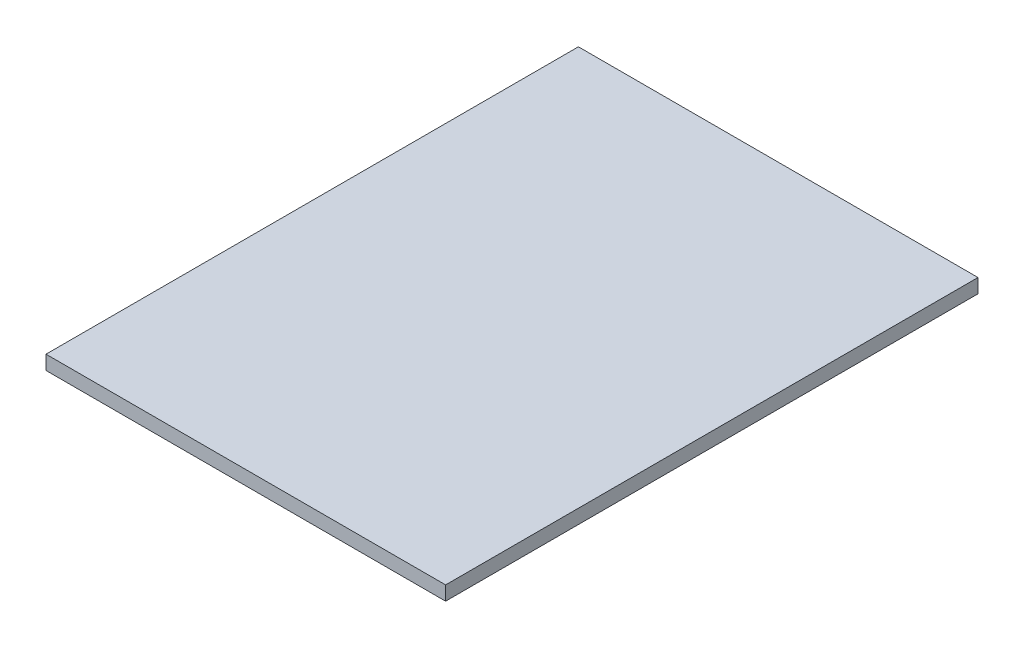
ISO-10303-21;
HEADER;
FILE_DESCRIPTION(('STEP AP214'),'2;1');
FILE_NAME('part.step','',(''),(''),'','','');
FILE_SCHEMA(('AUTOMOTIVE_DESIGN { 1 0 10303 214 1 1 1 1 }'));
ENDSEC;
DATA;
#1=APPLICATION_CONTEXT('core data for automotive mechanical design processes');
#2=APPLICATION_PROTOCOL_DEFINITION('international standard','automotive_design',2000,#1);
#3=PRODUCT_CONTEXT('',#1,'mechanical');
#4=PRODUCT('Part','Part','',(#3));
#5=PRODUCT_RELATED_PRODUCT_CATEGORY('part','',(#4));
#6=PRODUCT_DEFINITION_FORMATION('','',#4);
#7=PRODUCT_DEFINITION_CONTEXT('part definition',#1,'design');
#8=PRODUCT_DEFINITION('design','',#6,#7);
#9=PRODUCT_DEFINITION_SHAPE('','',#8);
#10=(LENGTH_UNIT() NAMED_UNIT(*) SI_UNIT(.MILLI.,.METRE.));
#11=(NAMED_UNIT(*) PLANE_ANGLE_UNIT() SI_UNIT($,.RADIAN.));
#12=(NAMED_UNIT(*) SI_UNIT($,.STERADIAN.) SOLID_ANGLE_UNIT());
#13=UNCERTAINTY_MEASURE_WITH_UNIT(LENGTH_MEASURE(1.E-05),#10,'distance_accuracy_value','');
#14=(GEOMETRIC_REPRESENTATION_CONTEXT(3) GLOBAL_UNCERTAINTY_ASSIGNED_CONTEXT((#13)) GLOBAL_UNIT_ASSIGNED_CONTEXT((#10,
#11,#12)) REPRESENTATION_CONTEXT('',''));
#15=CARTESIAN_POINT('',(0.,0.,0.));
#16=DIRECTION('',(0.,0.,1.));
#17=DIRECTION('',(1.,0.,0.));
#18=AXIS2_PLACEMENT_3D('',#15,#16,#17);
#19=CARTESIAN_POINT('',(-162.5,11.5,216.5));
#20=DIRECTION('',(1.,0.,0.));
#21=DIRECTION('',(0.,0.,-1.));
#22=AXIS2_PLACEMENT_3D('',#19,#20,#21);
#23=PLANE('',#22);
#24=DIRECTION('',(0.,0.,1.));
#25=VECTOR('',#24,1.);
#26=CARTESIAN_POINT('',(-162.5,0.,216.5));
#27=LINE('',#26,#25);
#28=CARTESIAN_POINT('',(-162.5,0.,-216.5));
#29=VERTEX_POINT('',#28);
#30=CARTESIAN_POINT('',(-162.5,0.,216.5));
#31=VERTEX_POINT('',#30);
#32=EDGE_CURVE('E96',#29,#31,#27,.T.);
#33=ORIENTED_EDGE('',*,*,#32,.T.);
#34=DIRECTION('',(0.,-1.,0.));
#35=VECTOR('',#34,1.);
#36=CARTESIAN_POINT('',(-162.5,11.5,216.5));
#37=LINE('',#36,#35);
#38=CARTESIAN_POINT('',(-162.5,11.5,216.5));
#39=VERTEX_POINT('',#38);
#40=EDGE_CURVE('E11',#39,#31,#37,.T.);
#41=ORIENTED_EDGE('',*,*,#40,.F.);
#42=DIRECTION('',(0.,0.,1.));
#43=VECTOR('',#42,1.);
#44=CARTESIAN_POINT('',(-162.5,11.5,216.5));
#45=LINE('',#44,#43);
#46=CARTESIAN_POINT('',(-162.5,11.5,-216.5));
#47=VERTEX_POINT('',#46);
#48=EDGE_CURVE('E84',#47,#39,#45,.T.);
#49=ORIENTED_EDGE('',*,*,#48,.F.);
#50=DIRECTION('',(0.,-1.,0.));
#51=VECTOR('',#50,1.);
#52=CARTESIAN_POINT('',(-162.5,11.5,-216.5));
#53=LINE('',#52,#51);
#54=EDGE_CURVE('E92',#47,#29,#53,.T.);
#55=ORIENTED_EDGE('',*,*,#54,.T.);
#56=EDGE_LOOP('',(#33,#41,#49,#55));
#57=FACE_BOUND('',#56,.T.);
#58=ADVANCED_FACE('F33',(#57),#23,.F.);
#59=CARTESIAN_POINT('',(162.5,11.5,216.5));
#60=DIRECTION('',(0.,0.,-1.));
#61=DIRECTION('',(-1.,0.,0.));
#62=AXIS2_PLACEMENT_3D('',#59,#60,#61);
#63=PLANE('',#62);
#64=DIRECTION('',(1.,0.,0.));
#65=VECTOR('',#64,1.);
#66=CARTESIAN_POINT('',(162.5,0.,216.5));
#67=LINE('',#66,#65);
#68=CARTESIAN_POINT('',(162.5,0.,216.5));
#69=VERTEX_POINT('',#68);
#70=EDGE_CURVE('E88',#31,#69,#67,.T.);
#71=ORIENTED_EDGE('',*,*,#70,.T.);
#72=DIRECTION('',(0.,-1.,0.));
#73=VECTOR('',#72,1.);
#74=CARTESIAN_POINT('',(162.5,11.5,216.5));
#75=LINE('',#74,#73);
#76=CARTESIAN_POINT('',(162.5,11.5,216.5));
#77=VERTEX_POINT('',#76);
#78=EDGE_CURVE('E41',#77,#69,#75,.T.);
#79=ORIENTED_EDGE('',*,*,#78,.F.);
#80=DIRECTION('',(1.,0.,0.));
#81=VECTOR('',#80,1.);
#82=CARTESIAN_POINT('',(162.5,11.5,216.5));
#83=LINE('',#82,#81);
#84=EDGE_CURVE('E79',#39,#77,#83,.T.);
#85=ORIENTED_EDGE('',*,*,#84,.F.);
#86=ORIENTED_EDGE('',*,*,#40,.T.);
#87=EDGE_LOOP('',(#71,#79,#85,#86));
#88=FACE_BOUND('',#87,.T.);
#89=ADVANCED_FACE('F87',(#88),#63,.F.);
#90=CARTESIAN_POINT('',(162.5,11.5,216.5));
#91=DIRECTION('',(-1.,0.,0.));
#92=DIRECTION('',(0.,0.,1.));
#93=AXIS2_PLACEMENT_3D('',#90,#91,#92);
#94=PLANE('',#93);
#95=DIRECTION('',(0.,0.,-1.));
#96=VECTOR('',#95,1.);
#97=CARTESIAN_POINT('',(162.5,0.,216.5));
#98=LINE('',#97,#96);
#99=CARTESIAN_POINT('',(162.5,0.,-216.5));
#100=VERTEX_POINT('',#99);
#101=EDGE_CURVE('E66',#69,#100,#98,.T.);
#102=ORIENTED_EDGE('',*,*,#101,.T.);
#103=DIRECTION('',(0.,-1.,0.));
#104=VECTOR('',#103,1.);
#105=CARTESIAN_POINT('',(162.5,11.5,-216.5));
#106=LINE('',#105,#104);
#107=CARTESIAN_POINT('',(162.5,11.5,-216.5));
#108=VERTEX_POINT('',#107);
#109=EDGE_CURVE('E89',#108,#100,#106,.T.);
#110=ORIENTED_EDGE('',*,*,#109,.F.);
#111=DIRECTION('',(0.,0.,-1.));
#112=VECTOR('',#111,1.);
#113=CARTESIAN_POINT('',(162.5,11.5,216.5));
#114=LINE('',#113,#112);
#115=EDGE_CURVE('E82',#77,#108,#114,.T.);
#116=ORIENTED_EDGE('',*,*,#115,.F.);
#117=ORIENTED_EDGE('',*,*,#78,.T.);
#118=EDGE_LOOP('',(#102,#110,#116,#117));
#119=FACE_BOUND('',#118,.T.);
#120=ADVANCED_FACE('F90',(#119),#94,.F.);
#121=CARTESIAN_POINT('',(162.5,11.5,-216.5));
#122=DIRECTION('',(0.,0.,1.));
#123=DIRECTION('',(1.,0.,0.));
#124=AXIS2_PLACEMENT_3D('',#121,#122,#123);
#125=PLANE('',#124);
#126=DIRECTION('',(-1.,0.,0.));
#127=VECTOR('',#126,1.);
#128=CARTESIAN_POINT('',(162.5,0.,-216.5));
#129=LINE('',#128,#127);
#130=EDGE_CURVE('E72',#100,#29,#129,.T.);
#131=ORIENTED_EDGE('',*,*,#130,.T.);
#132=ORIENTED_EDGE('',*,*,#54,.F.);
#133=DIRECTION('',(-1.,0.,0.));
#134=VECTOR('',#133,1.);
#135=CARTESIAN_POINT('',(162.5,11.5,-216.5));
#136=LINE('',#135,#134);
#137=EDGE_CURVE('E49',#108,#47,#136,.T.);
#138=ORIENTED_EDGE('',*,*,#137,.F.);
#139=ORIENTED_EDGE('',*,*,#109,.T.);
#140=EDGE_LOOP('',(#131,#132,#138,#139));
#141=FACE_BOUND('',#140,.T.);
#142=ADVANCED_FACE('F103',(#141),#125,.F.);
#143=CARTESIAN_POINT('',(0.,11.5,0.));
#144=DIRECTION('',(0.,1.,0.));
#145=DIRECTION('',(0.,0.,1.));
#146=AXIS2_PLACEMENT_3D('',#143,#144,#145);
#147=PLANE('',#146);
#148=ORIENTED_EDGE('',*,*,#48,.T.);
#149=ORIENTED_EDGE('',*,*,#84,.T.);
#150=ORIENTED_EDGE('',*,*,#115,.T.);
#151=ORIENTED_EDGE('',*,*,#137,.T.);
#152=EDGE_LOOP('',(#148,#149,#150,#151));
#153=FACE_BOUND('',#152,.T.);
#154=ADVANCED_FACE('F80',(#153),#147,.T.);
#155=CARTESIAN_POINT('',(0.,0.,0.));
#156=DIRECTION('',(0.,1.,0.));
#157=DIRECTION('',(0.,0.,1.));
#158=AXIS2_PLACEMENT_3D('',#155,#156,#157);
#159=PLANE('',#158);
#160=ORIENTED_EDGE('',*,*,#32,.F.);
#161=ORIENTED_EDGE('',*,*,#130,.F.);
#162=ORIENTED_EDGE('',*,*,#101,.F.);
#163=ORIENTED_EDGE('',*,*,#70,.F.);
#164=EDGE_LOOP('',(#160,#161,#162,#163));
#165=FACE_BOUND('',#164,.T.);
#166=ADVANCED_FACE('F106',(#165),#159,.F.);
#167=CLOSED_SHELL('',(#58,#89,#120,#142,#154,#166));
#168=MANIFOLD_SOLID_BREP('B2',#167);
#169=ADVANCED_BREP_SHAPE_REPRESENTATION('',(#18,#168),#14);
#170=SHAPE_DEFINITION_REPRESENTATION(#9,#169);
ENDSEC;
END-ISO-10303-21;
